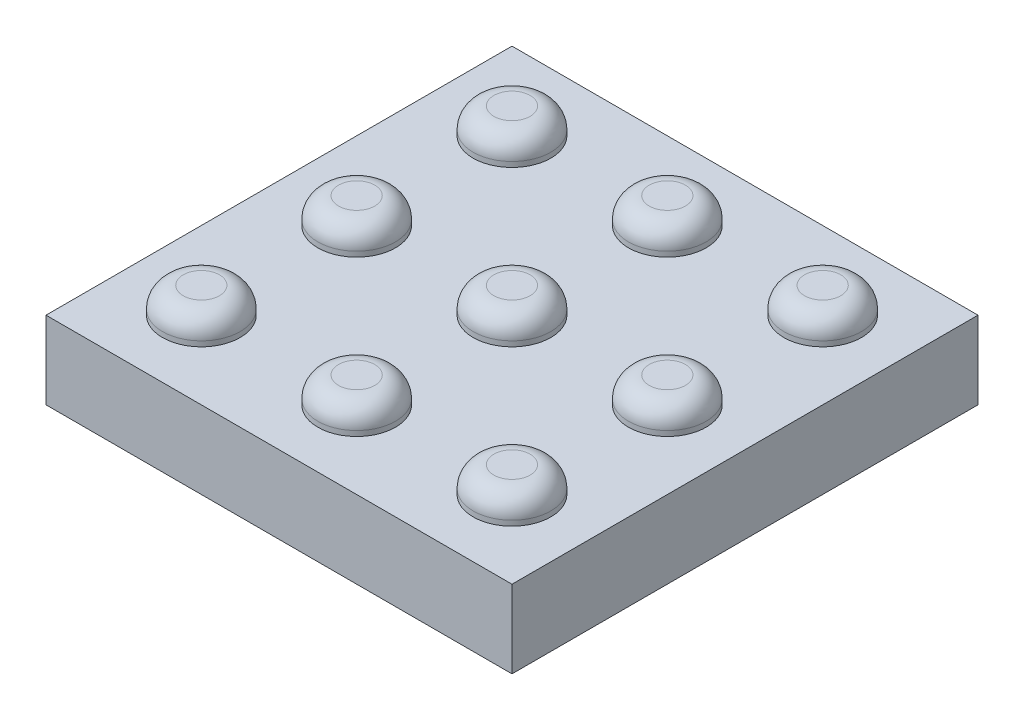
ISO-10303-21;
HEADER;
FILE_DESCRIPTION(('STEP AP214'),'2;1');
FILE_NAME('part.step','',(''),(''),'','','');
FILE_SCHEMA(('AUTOMOTIVE_DESIGN { 1 0 10303 214 1 1 1 1 }'));
ENDSEC;
DATA;
#1=APPLICATION_CONTEXT('core data for automotive mechanical design processes');
#2=APPLICATION_PROTOCOL_DEFINITION('international standard','automotive_design',2000,#1);
#3=PRODUCT_CONTEXT('',#1,'mechanical');
#4=PRODUCT('Part','Part','',(#3));
#5=PRODUCT_RELATED_PRODUCT_CATEGORY('part','',(#4));
#6=PRODUCT_DEFINITION_FORMATION('','',#4);
#7=PRODUCT_DEFINITION_CONTEXT('part definition',#1,'design');
#8=PRODUCT_DEFINITION('design','',#6,#7);
#9=PRODUCT_DEFINITION_SHAPE('','',#8);
#10=(LENGTH_UNIT() NAMED_UNIT(*) SI_UNIT(.MILLI.,.METRE.));
#11=(NAMED_UNIT(*) PLANE_ANGLE_UNIT() SI_UNIT($,.RADIAN.));
#12=(NAMED_UNIT(*) SI_UNIT($,.STERADIAN.) SOLID_ANGLE_UNIT());
#13=UNCERTAINTY_MEASURE_WITH_UNIT(LENGTH_MEASURE(1.E-05),#10,'distance_accuracy_value','');
#14=(GEOMETRIC_REPRESENTATION_CONTEXT(3) GLOBAL_UNCERTAINTY_ASSIGNED_CONTEXT((#13)) GLOBAL_UNIT_ASSIGNED_CONTEXT((#10,
#11,#12)) REPRESENTATION_CONTEXT('',''));
#15=CARTESIAN_POINT('',(0.,0.,0.));
#16=DIRECTION('',(0.,0.,1.));
#17=DIRECTION('',(1.,0.,0.));
#18=AXIS2_PLACEMENT_3D('',#15,#16,#17);
#19=CARTESIAN_POINT('',(-38.099999999998,-38.1,190.5));
#20=DIRECTION('',(0.,0.,1.));
#21=DIRECTION('',(1.,0.,0.));
#22=AXIS2_PLACEMENT_3D('',#19,#20,#21);
#23=PLANE('',#22);
#24=DIRECTION('',(1.,0.,0.));
#25=VECTOR('',#24,1.);
#26=CARTESIAN_POINT('',(-38.099999999998,0.,190.5));
#27=LINE('',#26,#25);
#28=CARTESIAN_POINT('',(-38.099999999998,0.,190.5));
#29=VERTEX_POINT('',#28);
#30=CARTESIAN_POINT('',(190.500000000002,0.,190.499999999998));
#31=VERTEX_POINT('',#30);
#32=EDGE_CURVE('E107',#29,#31,#27,.T.);
#33=ORIENTED_EDGE('',*,*,#32,.F.);
#34=DIRECTION('',(0.,1.,0.));
#35=VECTOR('',#34,1.);
#36=CARTESIAN_POINT('',(-38.099999999998,-38.1,190.5));
#37=LINE('',#36,#35);
#38=CARTESIAN_POINT('',(-38.099999999998,-38.1,190.5));
#39=VERTEX_POINT('',#38);
#40=EDGE_CURVE('E54',#39,#29,#37,.T.);
#41=ORIENTED_EDGE('',*,*,#40,.F.);
#42=DIRECTION('',(1.,0.,0.));
#43=VECTOR('',#42,1.);
#44=CARTESIAN_POINT('',(-38.099999999998,-38.1,190.5));
#45=LINE('',#44,#43);
#46=CARTESIAN_POINT('',(190.500000000002,-38.1,190.499999999998));
#47=VERTEX_POINT('',#46);
#48=EDGE_CURVE('E101',#39,#47,#45,.T.);
#49=ORIENTED_EDGE('',*,*,#48,.T.);
#50=DIRECTION('',(0.,1.,0.));
#51=VECTOR('',#50,1.);
#52=CARTESIAN_POINT('',(190.500000000002,-38.1,190.499999999998));
#53=LINE('',#52,#51);
#54=EDGE_CURVE('E79',#47,#31,#53,.T.);
#55=ORIENTED_EDGE('',*,*,#54,.T.);
#56=EDGE_LOOP('',(#33,#41,#49,#55));
#57=FACE_BOUND('',#56,.T.);
#58=ADVANCED_FACE('F37',(#57),#23,.T.);
#59=CARTESIAN_POINT('',(-38.099999999998,-38.1,190.5));
#60=DIRECTION('',(1.,0.,0.));
#61=DIRECTION('',(0.,0.,-1.));
#62=AXIS2_PLACEMENT_3D('',#59,#60,#61);
#63=PLANE('',#62);
#64=DIRECTION('',(0.,0.,-1.));
#65=VECTOR('',#64,1.);
#66=CARTESIAN_POINT('',(-38.099999999998,0.,190.5));
#67=LINE('',#66,#65);
#68=CARTESIAN_POINT('',(-38.1000000000004,0.,-38.0999999999996));
#69=VERTEX_POINT('',#68);
#70=EDGE_CURVE('E71',#29,#69,#67,.T.);
#71=ORIENTED_EDGE('',*,*,#70,.T.);
#72=DIRECTION('',(0.,1.,0.));
#73=VECTOR('',#72,1.);
#74=CARTESIAN_POINT('',(-38.1000000000004,-38.1,-38.0999999999996));
#75=LINE('',#74,#73);
#76=CARTESIAN_POINT('',(-38.1000000000004,-38.1,-38.0999999999996));
#77=VERTEX_POINT('',#76);
#78=EDGE_CURVE('E98',#77,#69,#75,.T.);
#79=ORIENTED_EDGE('',*,*,#78,.F.);
#80=DIRECTION('',(0.,0.,-1.));
#81=VECTOR('',#80,1.);
#82=CARTESIAN_POINT('',(-38.099999999998,-38.1,190.5));
#83=LINE('',#82,#81);
#84=EDGE_CURVE('E89',#39,#77,#83,.T.);
#85=ORIENTED_EDGE('',*,*,#84,.F.);
#86=ORIENTED_EDGE('',*,*,#40,.T.);
#87=EDGE_LOOP('',(#71,#79,#85,#86));
#88=FACE_BOUND('',#87,.T.);
#89=ADVANCED_FACE('F180',(#88),#63,.F.);
#90=CARTESIAN_POINT('',(-38.1000000000004,-38.1,-38.0999999999996));
#91=DIRECTION('',(0.,0.,1.));
#92=DIRECTION('',(1.,0.,0.));
#93=AXIS2_PLACEMENT_3D('',#90,#91,#92);
#94=PLANE('',#93);
#95=DIRECTION('',(1.,0.,0.));
#96=VECTOR('',#95,1.);
#97=CARTESIAN_POINT('',(-38.1000000000004,0.,-38.0999999999996));
#98=LINE('',#97,#96);
#99=CARTESIAN_POINT('',(190.5,0.,-38.100000000002));
#100=VERTEX_POINT('',#99);
#101=EDGE_CURVE('E96',#69,#100,#98,.T.);
#102=ORIENTED_EDGE('',*,*,#101,.T.);
#103=DIRECTION('',(0.,1.,0.));
#104=VECTOR('',#103,1.);
#105=CARTESIAN_POINT('',(190.5,-38.1,-38.100000000002));
#106=LINE('',#105,#104);
#107=CARTESIAN_POINT('',(190.5,-38.1,-38.100000000002));
#108=VERTEX_POINT('',#107);
#109=EDGE_CURVE('E93',#108,#100,#106,.T.);
#110=ORIENTED_EDGE('',*,*,#109,.F.);
#111=DIRECTION('',(1.,0.,0.));
#112=VECTOR('',#111,1.);
#113=CARTESIAN_POINT('',(-38.1000000000004,-38.1,-38.0999999999996));
#114=LINE('',#113,#112);
#115=EDGE_CURVE('E84',#77,#108,#114,.T.);
#116=ORIENTED_EDGE('',*,*,#115,.F.);
#117=ORIENTED_EDGE('',*,*,#78,.T.);
#118=EDGE_LOOP('',(#102,#110,#116,#117));
#119=FACE_BOUND('',#118,.T.);
#120=ADVANCED_FACE('F94',(#119),#94,.F.);
#121=CARTESIAN_POINT('',(190.500000000002,-38.1,190.499999999998));
#122=DIRECTION('',(1.,0.,0.));
#123=DIRECTION('',(0.,0.,-1.));
#124=AXIS2_PLACEMENT_3D('',#121,#122,#123);
#125=PLANE('',#124);
#126=DIRECTION('',(0.,0.,-1.));
#127=VECTOR('',#126,1.);
#128=CARTESIAN_POINT('',(190.500000000002,0.,190.499999999998));
#129=LINE('',#128,#127);
#130=EDGE_CURVE('E110',#31,#100,#129,.T.);
#131=ORIENTED_EDGE('',*,*,#130,.F.);
#132=ORIENTED_EDGE('',*,*,#54,.F.);
#133=DIRECTION('',(0.,0.,-1.));
#134=VECTOR('',#133,1.);
#135=CARTESIAN_POINT('',(190.500000000002,-38.1,190.499999999998));
#136=LINE('',#135,#134);
#137=EDGE_CURVE('E88',#47,#108,#136,.T.);
#138=ORIENTED_EDGE('',*,*,#137,.T.);
#139=ORIENTED_EDGE('',*,*,#109,.T.);
#140=EDGE_LOOP('',(#131,#132,#138,#139));
#141=FACE_BOUND('',#140,.T.);
#142=ADVANCED_FACE('F100',(#141),#125,.T.);
#143=CARTESIAN_POINT('',(0.,-38.1,0.));
#144=DIRECTION('',(0.,1.,0.));
#145=DIRECTION('',(0.,0.,1.));
#146=AXIS2_PLACEMENT_3D('',#143,#144,#145);
#147=PLANE('',#146);
#148=ORIENTED_EDGE('',*,*,#48,.F.);
#149=ORIENTED_EDGE('',*,*,#84,.T.);
#150=ORIENTED_EDGE('',*,*,#115,.T.);
#151=ORIENTED_EDGE('',*,*,#137,.F.);
#152=EDGE_LOOP('',(#148,#149,#150,#151));
#153=FACE_BOUND('',#152,.T.);
#154=ADVANCED_FACE('F87',(#153),#147,.F.);
#155=CARTESIAN_POINT('',(0.,0.,0.));
#156=DIRECTION('',(0.,1.,0.));
#157=DIRECTION('',(0.,0.,1.));
#158=AXIS2_PLACEMENT_3D('',#155,#156,#157);
#159=PLANE('',#158);
#160=CARTESIAN_POINT('',(152.400000000002,0.,152.399999999998));
#161=DIRECTION('',(0.,1.,0.));
#162=DIRECTION('',(0.,0.,1.));
#163=AXIS2_PLACEMENT_3D('',#160,#161,#162);
#164=CIRCLE('',#163,19.0499999999996);
#165=CARTESIAN_POINT('',(152.400000000002,0.,171.449999999998));
#166=VERTEX_POINT('',#165);
#167=EDGE_CURVE('E562',#166,#166,#164,.T.);
#168=ORIENTED_EDGE('',*,*,#167,.F.);
#169=EDGE_LOOP('',(#168));
#170=FACE_BOUND('',#169,.T.);
#171=CARTESIAN_POINT('',(76.2000000000016,0.,152.4));
#172=DIRECTION('',(0.,1.,0.));
#173=DIRECTION('',(0.,0.,1.));
#174=AXIS2_PLACEMENT_3D('',#171,#172,#173);
#175=CIRCLE('',#174,19.05);
#176=CARTESIAN_POINT('',(76.2000000000016,0.,171.45));
#177=VERTEX_POINT('',#176);
#178=EDGE_CURVE('E563',#177,#177,#175,.T.);
#179=ORIENTED_EDGE('',*,*,#178,.F.);
#180=EDGE_LOOP('',(#179));
#181=FACE_BOUND('',#180,.T.);
#182=CARTESIAN_POINT('',(1.58697345950958E-12,0.,152.4));
#183=DIRECTION('',(0.,1.,0.));
#184=DIRECTION('',(0.,0.,1.));
#185=AXIS2_PLACEMENT_3D('',#182,#183,#184);
#186=CIRCLE('',#185,19.05);
#187=CARTESIAN_POINT('',(1.58697345950958E-12,0.,171.45));
#188=VERTEX_POINT('',#187);
#189=EDGE_CURVE('E566',#188,#188,#186,.T.);
#190=ORIENTED_EDGE('',*,*,#189,.F.);
#191=EDGE_LOOP('',(#190));
#192=FACE_BOUND('',#191,.T.);
#193=CARTESIAN_POINT('',(7.93486729754789E-13,0.,76.2));
#194=DIRECTION('',(0.,1.,0.));
#195=DIRECTION('',(0.,0.,1.));
#196=AXIS2_PLACEMENT_3D('',#193,#194,#195);
#197=CIRCLE('',#196,19.05);
#198=CARTESIAN_POINT('',(7.93486729754789E-13,0.,95.25));
#199=VERTEX_POINT('',#198);
#200=EDGE_CURVE('E571',#199,#199,#197,.T.);
#201=ORIENTED_EDGE('',*,*,#200,.F.);
#202=EDGE_LOOP('',(#201));
#203=FACE_BOUND('',#202,.T.);
#204=CARTESIAN_POINT('',(0.,0.,0.));
#205=DIRECTION('',(0.,1.,0.));
#206=DIRECTION('',(0.,0.,1.));
#207=AXIS2_PLACEMENT_3D('',#204,#205,#206);
#208=CIRCLE('',#207,19.05);
#209=CARTESIAN_POINT('',(0.,0.,19.05));
#210=VERTEX_POINT('',#209);
#211=EDGE_CURVE('E574',#210,#210,#208,.T.);
#212=ORIENTED_EDGE('',*,*,#211,.F.);
#213=EDGE_LOOP('',(#212));
#214=FACE_BOUND('',#213,.T.);
#215=CARTESIAN_POINT('',(76.2,0.,-7.93486729754823E-13));
#216=DIRECTION('',(0.,1.,0.));
#217=DIRECTION('',(0.,0.,1.));
#218=AXIS2_PLACEMENT_3D('',#215,#216,#217);
#219=CIRCLE('',#218,19.0499999999998);
#220=CARTESIAN_POINT('',(76.2,0.,19.049999999999));
#221=VERTEX_POINT('',#220);
#222=EDGE_CURVE('E577',#221,#221,#219,.T.);
#223=ORIENTED_EDGE('',*,*,#222,.F.);
#224=EDGE_LOOP('',(#223));
#225=FACE_BOUND('',#224,.T.);
#226=CARTESIAN_POINT('',(152.4,0.,-1.58697345950964E-12));
#227=DIRECTION('',(0.,1.,0.));
#228=DIRECTION('',(0.,0.,1.));
#229=AXIS2_PLACEMENT_3D('',#226,#227,#228);
#230=CIRCLE('',#229,19.0499999999995);
#231=CARTESIAN_POINT('',(152.4,0.,19.049999999998));
#232=VERTEX_POINT('',#231);
#233=EDGE_CURVE('E580',#232,#232,#230,.T.);
#234=ORIENTED_EDGE('',*,*,#233,.F.);
#235=EDGE_LOOP('',(#234));
#236=FACE_BOUND('',#235,.T.);
#237=CARTESIAN_POINT('',(152.400000000001,0.,76.1999999999984));
#238=DIRECTION('',(0.,1.,0.));
#239=DIRECTION('',(0.,0.,1.));
#240=AXIS2_PLACEMENT_3D('',#237,#238,#239);
#241=CIRCLE('',#240,19.0499999999995);
#242=CARTESIAN_POINT('',(152.400000000001,0.,95.249999999998));
#243=VERTEX_POINT('',#242);
#244=EDGE_CURVE('E583',#243,#243,#241,.T.);
#245=ORIENTED_EDGE('',*,*,#244,.F.);
#246=EDGE_LOOP('',(#245));
#247=FACE_BOUND('',#246,.T.);
#248=CARTESIAN_POINT('',(76.2000000000008,0.,76.1999999999992));
#249=DIRECTION('',(0.,1.,0.));
#250=DIRECTION('',(0.,0.,1.));
#251=AXIS2_PLACEMENT_3D('',#248,#249,#250);
#252=CIRCLE('',#251,19.0499999999998);
#253=CARTESIAN_POINT('',(76.2000000000008,0.,95.249999999999));
#254=VERTEX_POINT('',#253);
#255=EDGE_CURVE('E111',#254,#254,#252,.T.);
#256=ORIENTED_EDGE('',*,*,#255,.F.);
#257=EDGE_LOOP('',(#256));
#258=FACE_BOUND('',#257,.T.);
#259=ORIENTED_EDGE('',*,*,#32,.T.);
#260=ORIENTED_EDGE('',*,*,#130,.T.);
#261=ORIENTED_EDGE('',*,*,#101,.F.);
#262=ORIENTED_EDGE('',*,*,#70,.F.);
#263=EDGE_LOOP('',(#259,#260,#261,#262));
#264=FACE_BOUND('',#263,.T.);
#265=ADVANCED_FACE('F269',(#170,#181,#192,#203,#214,#225,#236,#247,#258,#264),#159,.T.);
#266=CARTESIAN_POINT('',(76.2000000000008,12.7,76.1999999999992));
#267=DIRECTION('',(0.,-1.,0.));
#268=DIRECTION('',(0.,0.,-1.));
#269=AXIS2_PLACEMENT_3D('',#266,#267,#268);
#270=CYLINDRICAL_SURFACE('',#269,19.0499999999998);
#271=CARTESIAN_POINT('',(76.2000000000008,2.54,76.1999999999992));
#272=DIRECTION('',(0.,1.,0.));
#273=DIRECTION('',(0.,0.,1.));
#274=AXIS2_PLACEMENT_3D('',#271,#272,#273);
#275=CIRCLE('',#274,19.0499999999998);
#276=CARTESIAN_POINT('',(76.2000000000008,2.54,95.249999999999));
#277=VERTEX_POINT('',#276);
#278=EDGE_CURVE('E145',#277,#277,#275,.F.);
#279=ORIENTED_EDGE('',*,*,#278,.T.);
#280=EDGE_LOOP('',(#279));
#281=FACE_BOUND('',#280,.T.);
#282=ORIENTED_EDGE('',*,*,#255,.T.);
#283=EDGE_LOOP('',(#282));
#284=FACE_BOUND('',#283,.T.);
#285=ADVANCED_FACE('F265',(#281,#284),#270,.T.);
#286=CARTESIAN_POINT('',(76.2000000000008,12.7,76.1999999999992));
#287=DIRECTION('',(0.,1.,0.));
#288=DIRECTION('',(0.,0.,1.));
#289=AXIS2_PLACEMENT_3D('',#286,#287,#288);
#290=PLANE('',#289);
#291=CARTESIAN_POINT('',(76.2000000000008,12.7,76.1999999999992));
#292=DIRECTION('',(0.,1.,0.));
#293=DIRECTION('',(0.,0.,1.));
#294=AXIS2_PLACEMENT_3D('',#291,#292,#293);
#295=CIRCLE('',#294,8.88999999999977);
#296=CARTESIAN_POINT('',(76.2000000000008,12.7,85.089999999999));
#297=VERTEX_POINT('',#296);
#298=EDGE_CURVE('E142',#297,#297,#295,.T.);
#299=ORIENTED_EDGE('',*,*,#298,.T.);
#300=EDGE_LOOP('',(#299));
#301=FACE_BOUND('',#300,.T.);
#302=ADVANCED_FACE('F258',(#301),#290,.T.);
#303=CARTESIAN_POINT('',(152.400000000001,12.7,76.1999999999984));
#304=DIRECTION('',(0.,-1.,0.));
#305=DIRECTION('',(0.,0.,-1.));
#306=AXIS2_PLACEMENT_3D('',#303,#304,#305);
#307=CYLINDRICAL_SURFACE('',#306,19.0499999999995);
#308=CARTESIAN_POINT('',(152.400000000001,2.54,76.1999999999984));
#309=DIRECTION('',(0.,1.,0.));
#310=DIRECTION('',(0.,0.,1.));
#311=AXIS2_PLACEMENT_3D('',#308,#309,#310);
#312=CIRCLE('',#311,19.0499999999995);
#313=CARTESIAN_POINT('',(152.400000000001,2.54,95.249999999998));
#314=VERTEX_POINT('',#313);
#315=EDGE_CURVE('E127',#314,#314,#312,.F.);
#316=ORIENTED_EDGE('',*,*,#315,.T.);
#317=EDGE_LOOP('',(#316));
#318=FACE_BOUND('',#317,.T.);
#319=ORIENTED_EDGE('',*,*,#244,.T.);
#320=EDGE_LOOP('',(#319));
#321=FACE_BOUND('',#320,.T.);
#322=ADVANCED_FACE('F255',(#318,#321),#307,.T.);
#323=CARTESIAN_POINT('',(152.400000000001,12.7,76.1999999999984));
#324=DIRECTION('',(0.,1.,0.));
#325=DIRECTION('',(0.,0.,1.));
#326=AXIS2_PLACEMENT_3D('',#323,#324,#325);
#327=PLANE('',#326);
#328=CARTESIAN_POINT('',(152.400000000001,12.7,76.1999999999984));
#329=DIRECTION('',(0.,1.,0.));
#330=DIRECTION('',(0.,0.,1.));
#331=AXIS2_PLACEMENT_3D('',#328,#329,#330);
#332=CIRCLE('',#331,8.88999999999955);
#333=CARTESIAN_POINT('',(152.400000000001,12.7,85.089999999998));
#334=VERTEX_POINT('',#333);
#335=EDGE_CURVE('E124',#334,#334,#332,.T.);
#336=ORIENTED_EDGE('',*,*,#335,.T.);
#337=EDGE_LOOP('',(#336));
#338=FACE_BOUND('',#337,.T.);
#339=ADVANCED_FACE('F250',(#338),#327,.T.);
#340=CARTESIAN_POINT('',(152.4,12.7,-1.58697345950964E-12));
#341=DIRECTION('',(0.,-1.,0.));
#342=DIRECTION('',(0.,0.,-1.));
#343=AXIS2_PLACEMENT_3D('',#340,#341,#342);
#344=CYLINDRICAL_SURFACE('',#343,19.0499999999995);
#345=CARTESIAN_POINT('',(152.4,2.54,-1.58697345950964E-12));
#346=DIRECTION('',(0.,1.,0.));
#347=DIRECTION('',(0.,0.,1.));
#348=AXIS2_PLACEMENT_3D('',#345,#346,#347);
#349=CIRCLE('',#348,19.0499999999995);
#350=CARTESIAN_POINT('',(152.4,2.54,19.049999999998));
#351=VERTEX_POINT('',#350);
#352=EDGE_CURVE('E121',#351,#351,#349,.F.);
#353=ORIENTED_EDGE('',*,*,#352,.T.);
#354=EDGE_LOOP('',(#353));
#355=FACE_BOUND('',#354,.T.);
#356=ORIENTED_EDGE('',*,*,#233,.T.);
#357=EDGE_LOOP('',(#356));
#358=FACE_BOUND('',#357,.T.);
#359=ADVANCED_FACE('F247',(#355,#358),#344,.T.);
#360=CARTESIAN_POINT('',(152.4,12.7,-1.58697345950964E-12));
#361=DIRECTION('',(0.,1.,0.));
#362=DIRECTION('',(0.,0.,1.));
#363=AXIS2_PLACEMENT_3D('',#360,#361,#362);
#364=PLANE('',#363);
#365=CARTESIAN_POINT('',(152.4,12.7,-1.58697345950964E-12));
#366=DIRECTION('',(0.,1.,0.));
#367=DIRECTION('',(0.,0.,1.));
#368=AXIS2_PLACEMENT_3D('',#365,#366,#367);
#369=CIRCLE('',#368,8.88999999999955);
#370=CARTESIAN_POINT('',(152.4,12.7,8.88999999999796));
#371=VERTEX_POINT('',#370);
#372=EDGE_CURVE('E116',#371,#371,#369,.T.);
#373=ORIENTED_EDGE('',*,*,#372,.T.);
#374=EDGE_LOOP('',(#373));
#375=FACE_BOUND('',#374,.T.);
#376=ADVANCED_FACE('F242',(#375),#364,.T.);
#377=CARTESIAN_POINT('',(76.2,12.7,-7.93486729754823E-13));
#378=DIRECTION('',(0.,-1.,0.));
#379=DIRECTION('',(0.,0.,-1.));
#380=AXIS2_PLACEMENT_3D('',#377,#378,#379);
#381=CYLINDRICAL_SURFACE('',#380,19.0499999999998);
#382=CARTESIAN_POINT('',(76.2,2.54,-7.93486729754823E-13));
#383=DIRECTION('',(0.,1.,0.));
#384=DIRECTION('',(0.,0.,1.));
#385=AXIS2_PLACEMENT_3D('',#382,#383,#384);
#386=CIRCLE('',#385,19.0499999999998);
#387=CARTESIAN_POINT('',(76.2,2.54,19.049999999999));
#388=VERTEX_POINT('',#387);
#389=EDGE_CURVE('E151',#388,#388,#386,.F.);
#390=ORIENTED_EDGE('',*,*,#389,.T.);
#391=EDGE_LOOP('',(#390));
#392=FACE_BOUND('',#391,.T.);
#393=ORIENTED_EDGE('',*,*,#222,.T.);
#394=EDGE_LOOP('',(#393));
#395=FACE_BOUND('',#394,.T.);
#396=ADVANCED_FACE('F239',(#392,#395),#381,.T.);
#397=CARTESIAN_POINT('',(76.2,12.7,-7.93486729754823E-13));
#398=DIRECTION('',(0.,1.,0.));
#399=DIRECTION('',(0.,0.,1.));
#400=AXIS2_PLACEMENT_3D('',#397,#398,#399);
#401=PLANE('',#400);
#402=CARTESIAN_POINT('',(76.2,12.7,-7.93486729754823E-13));
#403=DIRECTION('',(0.,1.,0.));
#404=DIRECTION('',(0.,0.,1.));
#405=AXIS2_PLACEMENT_3D('',#402,#403,#404);
#406=CIRCLE('',#405,8.88999999999977);
#407=CARTESIAN_POINT('',(76.2,12.7,8.88999999999898));
#408=VERTEX_POINT('',#407);
#409=EDGE_CURVE('E148',#408,#408,#406,.T.);
#410=ORIENTED_EDGE('',*,*,#409,.T.);
#411=EDGE_LOOP('',(#410));
#412=FACE_BOUND('',#411,.T.);
#413=ADVANCED_FACE('F234',(#412),#401,.T.);
#414=CARTESIAN_POINT('',(0.,12.7,0.));
#415=DIRECTION('',(0.,-1.,0.));
#416=DIRECTION('',(0.,0.,-1.));
#417=AXIS2_PLACEMENT_3D('',#414,#415,#416);
#418=CYLINDRICAL_SURFACE('',#417,19.05);
#419=CARTESIAN_POINT('',(0.,2.54,0.));
#420=DIRECTION('',(0.,1.,0.));
#421=DIRECTION('',(0.,0.,1.));
#422=AXIS2_PLACEMENT_3D('',#419,#420,#421);
#423=CIRCLE('',#422,19.05);
#424=CARTESIAN_POINT('',(0.,2.54,19.05));
#425=VERTEX_POINT('',#424);
#426=EDGE_CURVE('E157',#425,#425,#423,.F.);
#427=ORIENTED_EDGE('',*,*,#426,.T.);
#428=EDGE_LOOP('',(#427));
#429=FACE_BOUND('',#428,.T.);
#430=ORIENTED_EDGE('',*,*,#211,.T.);
#431=EDGE_LOOP('',(#430));
#432=FACE_BOUND('',#431,.T.);
#433=ADVANCED_FACE('F225',(#429,#432),#418,.T.);
#434=CARTESIAN_POINT('',(0.,12.7,0.));
#435=DIRECTION('',(0.,1.,0.));
#436=DIRECTION('',(0.,0.,1.));
#437=AXIS2_PLACEMENT_3D('',#434,#435,#436);
#438=PLANE('',#437);
#439=CARTESIAN_POINT('',(0.,12.7,0.));
#440=DIRECTION('',(0.,1.,0.));
#441=DIRECTION('',(0.,0.,1.));
#442=AXIS2_PLACEMENT_3D('',#439,#440,#441);
#443=CIRCLE('',#442,8.89);
#444=CARTESIAN_POINT('',(0.,12.7,8.89));
#445=VERTEX_POINT('',#444);
#446=EDGE_CURVE('E154',#445,#445,#443,.T.);
#447=ORIENTED_EDGE('',*,*,#446,.T.);
#448=EDGE_LOOP('',(#447));
#449=FACE_BOUND('',#448,.T.);
#450=ADVANCED_FACE('F222',(#449),#438,.T.);
#451=CARTESIAN_POINT('',(7.93486729754789E-13,12.7,76.2));
#452=DIRECTION('',(0.,-1.,0.));
#453=DIRECTION('',(0.,0.,-1.));
#454=AXIS2_PLACEMENT_3D('',#451,#452,#453);
#455=CYLINDRICAL_SURFACE('',#454,19.05);
#456=CARTESIAN_POINT('',(7.93486729754789E-13,2.54,76.2));
#457=DIRECTION('',(0.,1.,0.));
#458=DIRECTION('',(0.,0.,1.));
#459=AXIS2_PLACEMENT_3D('',#456,#457,#458);
#460=CIRCLE('',#459,19.05);
#461=CARTESIAN_POINT('',(7.93486729754789E-13,2.54,95.25));
#462=VERTEX_POINT('',#461);
#463=EDGE_CURVE('E163',#462,#462,#460,.F.);
#464=ORIENTED_EDGE('',*,*,#463,.T.);
#465=EDGE_LOOP('',(#464));
#466=FACE_BOUND('',#465,.T.);
#467=ORIENTED_EDGE('',*,*,#200,.T.);
#468=EDGE_LOOP('',(#467));
#469=FACE_BOUND('',#468,.T.);
#470=ADVANCED_FACE('F224',(#466,#469),#455,.T.);
#471=CARTESIAN_POINT('',(7.93486729754789E-13,12.7,76.2));
#472=DIRECTION('',(0.,1.,0.));
#473=DIRECTION('',(0.,0.,1.));
#474=AXIS2_PLACEMENT_3D('',#471,#472,#473);
#475=PLANE('',#474);
#476=CARTESIAN_POINT('',(7.93486729754789E-13,12.7,76.2));
#477=DIRECTION('',(0.,1.,0.));
#478=DIRECTION('',(0.,0.,1.));
#479=AXIS2_PLACEMENT_3D('',#476,#477,#478);
#480=CIRCLE('',#479,8.89);
#481=CARTESIAN_POINT('',(7.93486729754789E-13,12.7,85.09));
#482=VERTEX_POINT('',#481);
#483=EDGE_CURVE('E160',#482,#482,#480,.T.);
#484=ORIENTED_EDGE('',*,*,#483,.T.);
#485=EDGE_LOOP('',(#484));
#486=FACE_BOUND('',#485,.T.);
#487=ADVANCED_FACE('F231',(#486),#475,.T.);
#488=CARTESIAN_POINT('',(1.58697345950958E-12,12.7,152.4));
#489=DIRECTION('',(0.,-1.,0.));
#490=DIRECTION('',(0.,0.,-1.));
#491=AXIS2_PLACEMENT_3D('',#488,#489,#490);
#492=CYLINDRICAL_SURFACE('',#491,19.05);
#493=CARTESIAN_POINT('',(1.58697345950958E-12,2.54,152.4));
#494=DIRECTION('',(0.,1.,0.));
#495=DIRECTION('',(0.,0.,1.));
#496=AXIS2_PLACEMENT_3D('',#493,#494,#495);
#497=CIRCLE('',#496,19.05);
#498=CARTESIAN_POINT('',(1.58697345950958E-12,2.54,171.45));
#499=VERTEX_POINT('',#498);
#500=EDGE_CURVE('E11',#499,#499,#497,.F.);
#501=ORIENTED_EDGE('',*,*,#500,.T.);
#502=EDGE_LOOP('',(#501));
#503=FACE_BOUND('',#502,.T.);
#504=ORIENTED_EDGE('',*,*,#189,.T.);
#505=EDGE_LOOP('',(#504));
#506=FACE_BOUND('',#505,.T.);
#507=ADVANCED_FACE('F347',(#503,#506),#492,.T.);
#508=CARTESIAN_POINT('',(1.58697345950958E-12,12.7,152.4));
#509=DIRECTION('',(0.,1.,0.));
#510=DIRECTION('',(0.,0.,1.));
#511=AXIS2_PLACEMENT_3D('',#508,#509,#510);
#512=PLANE('',#511);
#513=CARTESIAN_POINT('',(1.58697345950958E-12,12.7,152.4));
#514=DIRECTION('',(0.,1.,0.));
#515=DIRECTION('',(0.,0.,1.));
#516=AXIS2_PLACEMENT_3D('',#513,#514,#515);
#517=CIRCLE('',#516,8.89);
#518=CARTESIAN_POINT('',(1.58697345950958E-12,12.7,161.29));
#519=VERTEX_POINT('',#518);
#520=EDGE_CURVE('E46',#519,#519,#517,.T.);
#521=ORIENTED_EDGE('',*,*,#520,.T.);
#522=EDGE_LOOP('',(#521));
#523=FACE_BOUND('',#522,.T.);
#524=ADVANCED_FACE('F168',(#523),#512,.T.);
#525=CARTESIAN_POINT('',(76.2000000000016,12.7,152.4));
#526=DIRECTION('',(0.,-1.,0.));
#527=DIRECTION('',(0.,0.,-1.));
#528=AXIS2_PLACEMENT_3D('',#525,#526,#527);
#529=CYLINDRICAL_SURFACE('',#528,19.05);
#530=CARTESIAN_POINT('',(76.2000000000016,2.54,152.4));
#531=DIRECTION('',(0.,1.,0.));
#532=DIRECTION('',(0.,0.,1.));
#533=AXIS2_PLACEMENT_3D('',#530,#531,#532);
#534=CIRCLE('',#533,19.05);
#535=CARTESIAN_POINT('',(76.2000000000016,2.54,171.45));
#536=VERTEX_POINT('',#535);
#537=EDGE_CURVE('E139',#536,#536,#534,.F.);
#538=ORIENTED_EDGE('',*,*,#537,.T.);
#539=EDGE_LOOP('',(#538));
#540=FACE_BOUND('',#539,.T.);
#541=ORIENTED_EDGE('',*,*,#178,.T.);
#542=EDGE_LOOP('',(#541));
#543=FACE_BOUND('',#542,.T.);
#544=ADVANCED_FACE('F367',(#540,#543),#529,.T.);
#545=CARTESIAN_POINT('',(76.2000000000016,12.7,152.4));
#546=DIRECTION('',(0.,1.,0.));
#547=DIRECTION('',(0.,0.,1.));
#548=AXIS2_PLACEMENT_3D('',#545,#546,#547);
#549=PLANE('',#548);
#550=CARTESIAN_POINT('',(76.2000000000016,12.7,152.4));
#551=DIRECTION('',(0.,1.,0.));
#552=DIRECTION('',(0.,0.,1.));
#553=AXIS2_PLACEMENT_3D('',#550,#551,#552);
#554=CIRCLE('',#553,8.89);
#555=CARTESIAN_POINT('',(76.2000000000016,12.7,161.29));
#556=VERTEX_POINT('',#555);
#557=EDGE_CURVE('E136',#556,#556,#554,.T.);
#558=ORIENTED_EDGE('',*,*,#557,.T.);
#559=EDGE_LOOP('',(#558));
#560=FACE_BOUND('',#559,.T.);
#561=ADVANCED_FACE('F377',(#560),#549,.T.);
#562=CARTESIAN_POINT('',(152.400000000002,12.7,152.399999999998));
#563=DIRECTION('',(0.,-1.,0.));
#564=DIRECTION('',(0.,0.,-1.));
#565=AXIS2_PLACEMENT_3D('',#562,#563,#564);
#566=CYLINDRICAL_SURFACE('',#565,19.0499999999996);
#567=CARTESIAN_POINT('',(152.400000000002,2.54,152.399999999998));
#568=DIRECTION('',(0.,1.,0.));
#569=DIRECTION('',(0.,0.,1.));
#570=AXIS2_PLACEMENT_3D('',#567,#568,#569);
#571=CIRCLE('',#570,19.0499999999996);
#572=CARTESIAN_POINT('',(152.400000000002,2.54,171.449999999998));
#573=VERTEX_POINT('',#572);
#574=EDGE_CURVE('E133',#573,#573,#571,.F.);
#575=ORIENTED_EDGE('',*,*,#574,.T.);
#576=EDGE_LOOP('',(#575));
#577=FACE_BOUND('',#576,.T.);
#578=ORIENTED_EDGE('',*,*,#167,.T.);
#579=EDGE_LOOP('',(#578));
#580=FACE_BOUND('',#579,.T.);
#581=ADVANCED_FACE('F388',(#577,#580),#566,.T.);
#582=CARTESIAN_POINT('',(152.400000000002,12.7,152.399999999998));
#583=DIRECTION('',(0.,1.,0.));
#584=DIRECTION('',(0.,0.,1.));
#585=AXIS2_PLACEMENT_3D('',#582,#583,#584);
#586=PLANE('',#585);
#587=CARTESIAN_POINT('',(152.400000000002,12.7,152.399999999998));
#588=DIRECTION('',(0.,1.,0.));
#589=DIRECTION('',(0.,0.,1.));
#590=AXIS2_PLACEMENT_3D('',#587,#588,#589);
#591=CIRCLE('',#590,8.88999999999956);
#592=CARTESIAN_POINT('',(152.400000000002,12.7,161.289999999998));
#593=VERTEX_POINT('',#592);
#594=EDGE_CURVE('E130',#593,#593,#591,.T.);
#595=ORIENTED_EDGE('',*,*,#594,.T.);
#596=EDGE_LOOP('',(#595));
#597=FACE_BOUND('',#596,.T.);
#598=ADVANCED_FACE('F193',(#597),#586,.T.);
#599=CARTESIAN_POINT('',(152.4,2.54,-1.58697345950964E-12));
#600=DIRECTION('',(0.,1.,0.));
#601=DIRECTION('',(0.,0.,1.));
#602=AXIS2_PLACEMENT_3D('',#599,#600,#601);
#603=DEGENERATE_TOROIDAL_SURFACE('',#602,8.88999999999955,10.16,.T.);
#604=ORIENTED_EDGE('',*,*,#352,.F.);
#605=EDGE_LOOP('',(#604));
#606=FACE_BOUND('',#605,.T.);
#607=ORIENTED_EDGE('',*,*,#372,.F.);
#608=EDGE_LOOP('',(#607));
#609=FACE_BOUND('',#608,.T.);
#610=ADVANCED_FACE('F189',(#606,#609),#603,.T.);
#611=CARTESIAN_POINT('',(152.400000000001,2.54,76.1999999999984));
#612=DIRECTION('',(0.,1.,0.));
#613=DIRECTION('',(0.,0.,1.));
#614=AXIS2_PLACEMENT_3D('',#611,#612,#613);
#615=DEGENERATE_TOROIDAL_SURFACE('',#614,8.88999999999955,10.16,.T.);
#616=ORIENTED_EDGE('',*,*,#315,.F.);
#617=EDGE_LOOP('',(#616));
#618=FACE_BOUND('',#617,.T.);
#619=ORIENTED_EDGE('',*,*,#335,.F.);
#620=EDGE_LOOP('',(#619));
#621=FACE_BOUND('',#620,.T.);
#622=ADVANCED_FACE('F192',(#618,#621),#615,.T.);
#623=CARTESIAN_POINT('',(152.400000000002,2.54,152.399999999998));
#624=DIRECTION('',(0.,1.,0.));
#625=DIRECTION('',(0.,0.,1.));
#626=AXIS2_PLACEMENT_3D('',#623,#624,#625);
#627=DEGENERATE_TOROIDAL_SURFACE('',#626,8.88999999999956,10.16,.T.);
#628=ORIENTED_EDGE('',*,*,#574,.F.);
#629=EDGE_LOOP('',(#628));
#630=FACE_BOUND('',#629,.T.);
#631=ORIENTED_EDGE('',*,*,#594,.F.);
#632=EDGE_LOOP('',(#631));
#633=FACE_BOUND('',#632,.T.);
#634=ADVANCED_FACE('F197',(#630,#633),#627,.T.);
#635=CARTESIAN_POINT('',(76.2000000000016,2.54,152.4));
#636=DIRECTION('',(0.,1.,0.));
#637=DIRECTION('',(0.,0.,1.));
#638=AXIS2_PLACEMENT_3D('',#635,#636,#637);
#639=DEGENERATE_TOROIDAL_SURFACE('',#638,8.89,10.16,.T.);
#640=ORIENTED_EDGE('',*,*,#537,.F.);
#641=EDGE_LOOP('',(#640));
#642=FACE_BOUND('',#641,.T.);
#643=ORIENTED_EDGE('',*,*,#557,.F.);
#644=EDGE_LOOP('',(#643));
#645=FACE_BOUND('',#644,.T.);
#646=ADVANCED_FACE('F201',(#642,#645),#639,.T.);
#647=CARTESIAN_POINT('',(76.2000000000008,2.54,76.1999999999992));
#648=DIRECTION('',(0.,1.,0.));
#649=DIRECTION('',(0.,0.,1.));
#650=AXIS2_PLACEMENT_3D('',#647,#648,#649);
#651=DEGENERATE_TOROIDAL_SURFACE('',#650,8.88999999999977,10.16,.T.);
#652=ORIENTED_EDGE('',*,*,#278,.F.);
#653=EDGE_LOOP('',(#652));
#654=FACE_BOUND('',#653,.T.);
#655=ORIENTED_EDGE('',*,*,#298,.F.);
#656=EDGE_LOOP('',(#655));
#657=FACE_BOUND('',#656,.T.);
#658=ADVANCED_FACE('F205',(#654,#657),#651,.T.);
#659=CARTESIAN_POINT('',(76.2,2.54,-7.93486729754823E-13));
#660=DIRECTION('',(0.,1.,0.));
#661=DIRECTION('',(0.,0.,1.));
#662=AXIS2_PLACEMENT_3D('',#659,#660,#661);
#663=DEGENERATE_TOROIDAL_SURFACE('',#662,8.88999999999977,10.16,.T.);
#664=ORIENTED_EDGE('',*,*,#389,.F.);
#665=EDGE_LOOP('',(#664));
#666=FACE_BOUND('',#665,.T.);
#667=ORIENTED_EDGE('',*,*,#409,.F.);
#668=EDGE_LOOP('',(#667));
#669=FACE_BOUND('',#668,.T.);
#670=ADVANCED_FACE('F209',(#666,#669),#663,.T.);
#671=CARTESIAN_POINT('',(0.,2.54,0.));
#672=DIRECTION('',(0.,1.,0.));
#673=DIRECTION('',(0.,0.,1.));
#674=AXIS2_PLACEMENT_3D('',#671,#672,#673);
#675=DEGENERATE_TOROIDAL_SURFACE('',#674,8.89,10.16,.T.);
#676=ORIENTED_EDGE('',*,*,#426,.F.);
#677=EDGE_LOOP('',(#676));
#678=FACE_BOUND('',#677,.T.);
#679=ORIENTED_EDGE('',*,*,#446,.F.);
#680=EDGE_LOOP('',(#679));
#681=FACE_BOUND('',#680,.T.);
#682=ADVANCED_FACE('F176',(#678,#681),#675,.T.);
#683=CARTESIAN_POINT('',(7.93486729754789E-13,2.54,76.2));
#684=DIRECTION('',(0.,1.,0.));
#685=DIRECTION('',(0.,0.,1.));
#686=AXIS2_PLACEMENT_3D('',#683,#684,#685);
#687=DEGENERATE_TOROIDAL_SURFACE('',#686,8.89,10.16,.T.);
#688=ORIENTED_EDGE('',*,*,#463,.F.);
#689=EDGE_LOOP('',(#688));
#690=FACE_BOUND('',#689,.T.);
#691=ORIENTED_EDGE('',*,*,#483,.F.);
#692=EDGE_LOOP('',(#691));
#693=FACE_BOUND('',#692,.T.);
#694=ADVANCED_FACE('F171',(#690,#693),#687,.T.);
#695=CARTESIAN_POINT('',(1.58697345950958E-12,2.54,152.4));
#696=DIRECTION('',(0.,1.,0.));
#697=DIRECTION('',(0.,0.,1.));
#698=AXIS2_PLACEMENT_3D('',#695,#696,#697);
#699=DEGENERATE_TOROIDAL_SURFACE('',#698,8.89,10.16,.T.);
#700=ORIENTED_EDGE('',*,*,#500,.F.);
#701=EDGE_LOOP('',(#700));
#702=FACE_BOUND('',#701,.T.);
#703=ORIENTED_EDGE('',*,*,#520,.F.);
#704=EDGE_LOOP('',(#703));
#705=FACE_BOUND('',#704,.T.);
#706=ADVANCED_FACE('F39',(#702,#705),#699,.T.);
#707=CLOSED_SHELL('',(#58,#89,#120,#142,#154,#265,#285,#302,#322,#339,#359,#376,#396,#413,#433,
#450,#470,#487,#507,#524,#544,#561,#581,#598,#610,#622,#634,#646,#658,#670,#682,#694,#706));
#708=MANIFOLD_SOLID_BREP('B2',#707);
#709=ADVANCED_BREP_SHAPE_REPRESENTATION('',(#18,#708),#14);
#710=SHAPE_DEFINITION_REPRESENTATION(#9,#709);
ENDSEC;
END-ISO-10303-21;
